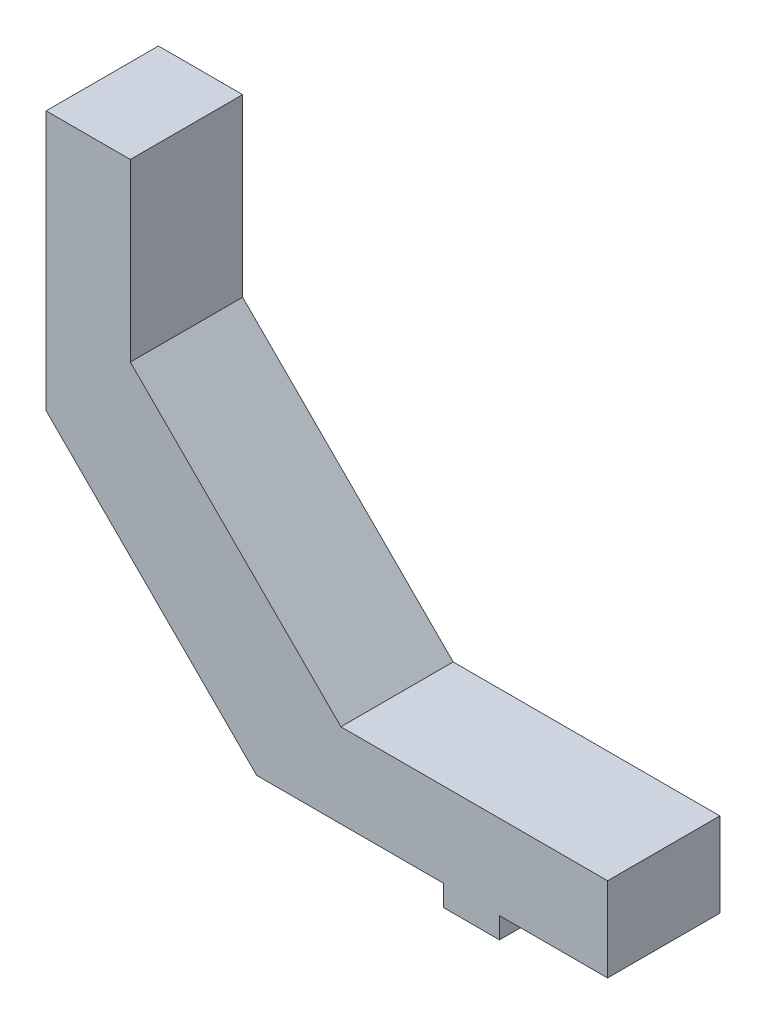
ISO-10303-21;
HEADER;
FILE_DESCRIPTION(('STEP AP214'),'2;1');
FILE_NAME('part.step','',(''),(''),'','','');
FILE_SCHEMA(('AUTOMOTIVE_DESIGN { 1 0 10303 214 1 1 1 1 }'));
ENDSEC;
DATA;
#1=APPLICATION_CONTEXT('core data for automotive mechanical design processes');
#2=APPLICATION_PROTOCOL_DEFINITION('international standard','automotive_design',2000,#1);
#3=PRODUCT_CONTEXT('',#1,'mechanical');
#4=PRODUCT('Part','Part','',(#3));
#5=PRODUCT_RELATED_PRODUCT_CATEGORY('part','',(#4));
#6=PRODUCT_DEFINITION_FORMATION('','',#4);
#7=PRODUCT_DEFINITION_CONTEXT('part definition',#1,'design');
#8=PRODUCT_DEFINITION('design','',#6,#7);
#9=PRODUCT_DEFINITION_SHAPE('','',#8);
#10=(LENGTH_UNIT() NAMED_UNIT(*) SI_UNIT(.MILLI.,.METRE.));
#11=(NAMED_UNIT(*) PLANE_ANGLE_UNIT() SI_UNIT($,.RADIAN.));
#12=(NAMED_UNIT(*) SI_UNIT($,.STERADIAN.) SOLID_ANGLE_UNIT());
#13=UNCERTAINTY_MEASURE_WITH_UNIT(LENGTH_MEASURE(1.E-05),#10,'distance_accuracy_value','');
#14=(GEOMETRIC_REPRESENTATION_CONTEXT(3) GLOBAL_UNCERTAINTY_ASSIGNED_CONTEXT((#13)) GLOBAL_UNIT_ASSIGNED_CONTEXT((#10,
#11,#12)) REPRESENTATION_CONTEXT('',''));
#15=CARTESIAN_POINT('',(0.,0.,0.));
#16=DIRECTION('',(0.,0.,1.));
#17=DIRECTION('',(1.,0.,0.));
#18=AXIS2_PLACEMENT_3D('',#15,#16,#17);
#19=CARTESIAN_POINT('',(0.,0.,0.));
#20=DIRECTION('',(0.,-1.,0.));
#21=DIRECTION('',(0.,0.,-1.));
#22=AXIS2_PLACEMENT_3D('',#19,#20,#21);
#23=PLANE('',#22);
#24=DIRECTION('',(1.,0.,0.));
#25=VECTOR('',#24,1.);
#26=CARTESIAN_POINT('',(-40.,0.,8.));
#27=LINE('',#26,#25);
#28=CARTESIAN_POINT('',(-9.99999999999989,0.,8.));
#29=VERTEX_POINT('',#28);
#30=CARTESIAN_POINT('',(16.6,0.,8.));
#31=VERTEX_POINT('',#30);
#32=EDGE_CURVE('E168',#29,#31,#27,.T.);
#33=ORIENTED_EDGE('',*,*,#32,.F.);
#34=DIRECTION('',(0.,0.,-1.));
#35=VECTOR('',#34,1.);
#36=CARTESIAN_POINT('',(-9.99999999999989,0.,-8.));
#37=LINE('',#36,#35);
#38=CARTESIAN_POINT('',(-9.99999999999989,0.,-8.));
#39=VERTEX_POINT('',#38);
#40=EDGE_CURVE('E27',#29,#39,#37,.T.);
#41=ORIENTED_EDGE('',*,*,#40,.T.);
#42=DIRECTION('',(-1.,0.,0.));
#43=VECTOR('',#42,1.);
#44=CARTESIAN_POINT('',(-40.,0.,-8.));
#45=LINE('',#44,#43);
#46=CARTESIAN_POINT('',(16.6,0.,-8.));
#47=VERTEX_POINT('',#46);
#48=EDGE_CURVE('E158',#47,#39,#45,.T.);
#49=ORIENTED_EDGE('',*,*,#48,.F.);
#50=DIRECTION('',(0.,0.,-1.));
#51=VECTOR('',#50,1.);
#52=CARTESIAN_POINT('',(16.6,0.,8.));
#53=LINE('',#52,#51);
#54=EDGE_CURVE('E131',#31,#47,#53,.T.);
#55=ORIENTED_EDGE('',*,*,#54,.F.);
#56=EDGE_LOOP('',(#33,#41,#49,#55));
#57=FACE_BOUND('',#56,.T.);
#58=ADVANCED_FACE('F19',(#57),#23,.T.);
#59=CARTESIAN_POINT('',(0.,12.,0.));
#60=DIRECTION('',(0.,-1.,0.));
#61=DIRECTION('',(0.,0.,-1.));
#62=AXIS2_PLACEMENT_3D('',#59,#60,#61);
#63=PLANE('',#62);
#64=DIRECTION('',(-1.,0.,0.));
#65=VECTOR('',#64,1.);
#66=CARTESIAN_POINT('',(-40.,12.,-8.));
#67=LINE('',#66,#65);
#68=CARTESIAN_POINT('',(40.,12.,-8.));
#69=VERTEX_POINT('',#68);
#70=CARTESIAN_POINT('',(1.99999999999991,12.,-8.));
#71=VERTEX_POINT('',#70);
#72=EDGE_CURVE('E202',#69,#71,#67,.T.);
#73=ORIENTED_EDGE('',*,*,#72,.T.);
#74=DIRECTION('',(0.,0.,1.));
#75=VECTOR('',#74,1.);
#76=CARTESIAN_POINT('',(1.99999999999992,12.,8.));
#77=LINE('',#76,#75);
#78=CARTESIAN_POINT('',(1.99999999999992,12.,8.));
#79=VERTEX_POINT('',#78);
#80=EDGE_CURVE('E247',#71,#79,#77,.T.);
#81=ORIENTED_EDGE('',*,*,#80,.T.);
#82=DIRECTION('',(1.,0.,0.));
#83=VECTOR('',#82,1.);
#84=CARTESIAN_POINT('',(-40.,12.,8.));
#85=LINE('',#84,#83);
#86=CARTESIAN_POINT('',(40.,12.,8.));
#87=VERTEX_POINT('',#86);
#88=EDGE_CURVE('E205',#79,#87,#85,.T.);
#89=ORIENTED_EDGE('',*,*,#88,.T.);
#90=DIRECTION('',(0.,0.,-1.));
#91=VECTOR('',#90,1.);
#92=CARTESIAN_POINT('',(40.,12.,8.));
#93=LINE('',#92,#91);
#94=EDGE_CURVE('E169',#87,#69,#93,.T.);
#95=ORIENTED_EDGE('',*,*,#94,.T.);
#96=EDGE_LOOP('',(#73,#81,#89,#95));
#97=FACE_BOUND('',#96,.T.);
#98=ADVANCED_FACE('F256',(#97),#63,.F.);
#99=CARTESIAN_POINT('',(40.,12.,8.));
#100=DIRECTION('',(-1.,0.,0.));
#101=DIRECTION('',(0.,0.,1.));
#102=AXIS2_PLACEMENT_3D('',#99,#100,#101);
#103=PLANE('',#102);
#104=DIRECTION('',(0.,0.,-1.));
#105=VECTOR('',#104,1.);
#106=CARTESIAN_POINT('',(40.,0.,8.));
#107=LINE('',#106,#105);
#108=CARTESIAN_POINT('',(40.,0.,8.));
#109=VERTEX_POINT('',#108);
#110=CARTESIAN_POINT('',(40.,0.,-8.));
#111=VERTEX_POINT('',#110);
#112=EDGE_CURVE('E174',#109,#111,#107,.T.);
#113=ORIENTED_EDGE('',*,*,#112,.T.);
#114=DIRECTION('',(0.,-1.,0.));
#115=VECTOR('',#114,1.);
#116=CARTESIAN_POINT('',(40.,12.,-8.));
#117=LINE('',#116,#115);
#118=EDGE_CURVE('E206',#69,#111,#117,.T.);
#119=ORIENTED_EDGE('',*,*,#118,.F.);
#120=ORIENTED_EDGE('',*,*,#94,.F.);
#121=DIRECTION('',(0.,-1.,0.));
#122=VECTOR('',#121,1.);
#123=CARTESIAN_POINT('',(40.,12.,8.));
#124=LINE('',#123,#122);
#125=EDGE_CURVE('E239',#87,#109,#124,.T.);
#126=ORIENTED_EDGE('',*,*,#125,.T.);
#127=EDGE_LOOP('',(#113,#119,#120,#126));
#128=FACE_BOUND('',#127,.T.);
#129=ADVANCED_FACE('F258',(#128),#103,.F.);
#130=CARTESIAN_POINT('',(-40.,12.,-8.));
#131=DIRECTION('',(0.,0.,1.));
#132=DIRECTION('',(1.,0.,0.));
#133=AXIS2_PLACEMENT_3D('',#130,#131,#132);
#134=PLANE('',#133);
#135=ORIENTED_EDGE('',*,*,#48,.T.);
#136=DIRECTION('',(-0.707106781186549,0.707106781186546,0.));
#137=VECTOR('',#136,1.);
#138=CARTESIAN_POINT('',(-40.,30.,-8.));
#139=LINE('',#138,#137);
#140=CARTESIAN_POINT('',(-40.,30.,-8.));
#141=VERTEX_POINT('',#140);
#142=EDGE_CURVE('E12',#39,#141,#139,.T.);
#143=ORIENTED_EDGE('',*,*,#142,.T.);
#144=DIRECTION('',(0.,-1.,0.));
#145=VECTOR('',#144,1.);
#146=CARTESIAN_POINT('',(-40.,12.,-8.));
#147=LINE('',#146,#145);
#148=CARTESIAN_POINT('',(-40.,67.,-8.));
#149=VERTEX_POINT('',#148);
#150=EDGE_CURVE('E232',#149,#141,#147,.T.);
#151=ORIENTED_EDGE('',*,*,#150,.F.);
#152=DIRECTION('',(-1.,0.,0.));
#153=VECTOR('',#152,1.);
#154=CARTESIAN_POINT('',(-40.,67.,-8.));
#155=LINE('',#154,#153);
#156=CARTESIAN_POINT('',(-28.,67.,-8.));
#157=VERTEX_POINT('',#156);
#158=EDGE_CURVE('E201',#157,#149,#155,.T.);
#159=ORIENTED_EDGE('',*,*,#158,.F.);
#160=DIRECTION('',(0.,-1.,0.));
#161=VECTOR('',#160,1.);
#162=CARTESIAN_POINT('',(-28.,67.,-8.));
#163=LINE('',#162,#161);
#164=CARTESIAN_POINT('',(-28.,42.,-8.));
#165=VERTEX_POINT('',#164);
#166=EDGE_CURVE('E183',#157,#165,#163,.T.);
#167=ORIENTED_EDGE('',*,*,#166,.T.);
#168=DIRECTION('',(-0.707106781186544,0.707106781186551,0.));
#169=VECTOR('',#168,1.);
#170=CARTESIAN_POINT('',(-19.,33.,-8.));
#171=LINE('',#170,#169);
#172=EDGE_CURVE('E249',#165,#71,#171,.F.);
#173=ORIENTED_EDGE('',*,*,#172,.T.);
#174=ORIENTED_EDGE('',*,*,#72,.F.);
#175=ORIENTED_EDGE('',*,*,#118,.T.);
#176=CARTESIAN_POINT('',(24.6,0.,-8.));
#177=VERTEX_POINT('',#176);
#178=EDGE_CURVE('E173',#111,#177,#45,.T.);
#179=ORIENTED_EDGE('',*,*,#178,.T.);
#180=DIRECTION('',(0.,1.,0.));
#181=VECTOR('',#180,1.);
#182=CARTESIAN_POINT('',(24.6,-3.,-8.));
#183=LINE('',#182,#181);
#184=CARTESIAN_POINT('',(24.6,-3.,-8.));
#185=VERTEX_POINT('',#184);
#186=EDGE_CURVE('E114',#185,#177,#183,.T.);
#187=ORIENTED_EDGE('',*,*,#186,.F.);
#188=DIRECTION('',(1.,0.,0.));
#189=VECTOR('',#188,1.);
#190=CARTESIAN_POINT('',(16.6,-3.,-8.));
#191=LINE('',#190,#189);
#192=CARTESIAN_POINT('',(16.6,-3.,-8.));
#193=VERTEX_POINT('',#192);
#194=EDGE_CURVE('E106',#193,#185,#191,.T.);
#195=ORIENTED_EDGE('',*,*,#194,.F.);
#196=DIRECTION('',(0.,1.,0.));
#197=VECTOR('',#196,1.);
#198=CARTESIAN_POINT('',(16.6,-3.,-8.));
#199=LINE('',#198,#197);
#200=EDGE_CURVE('E110',#193,#47,#199,.T.);
#201=ORIENTED_EDGE('',*,*,#200,.T.);
#202=EDGE_LOOP('',(#135,#143,#151,#159,#167,#173,#174,#175,#179,#187,#195,#201));
#203=FACE_BOUND('',#202,.T.);
#204=ADVANCED_FACE('F108',(#203),#134,.F.);
#205=CARTESIAN_POINT('',(-40.,12.,8.));
#206=DIRECTION('',(1.,0.,0.));
#207=DIRECTION('',(0.,0.,-1.));
#208=AXIS2_PLACEMENT_3D('',#205,#206,#207);
#209=PLANE('',#208);
#210=ORIENTED_EDGE('',*,*,#150,.T.);
#211=DIRECTION('',(0.,0.,1.));
#212=VECTOR('',#211,1.);
#213=CARTESIAN_POINT('',(-40.,30.,8.));
#214=LINE('',#213,#212);
#215=CARTESIAN_POINT('',(-40.,30.,8.));
#216=VERTEX_POINT('',#215);
#217=EDGE_CURVE('E238',#141,#216,#214,.T.);
#218=ORIENTED_EDGE('',*,*,#217,.T.);
#219=DIRECTION('',(0.,-1.,0.));
#220=VECTOR('',#219,1.);
#221=CARTESIAN_POINT('',(-40.,12.,8.));
#222=LINE('',#221,#220);
#223=CARTESIAN_POINT('',(-40.,67.,8.));
#224=VERTEX_POINT('',#223);
#225=EDGE_CURVE('E237',#224,#216,#222,.T.);
#226=ORIENTED_EDGE('',*,*,#225,.F.);
#227=DIRECTION('',(0.,0.,1.));
#228=VECTOR('',#227,1.);
#229=CARTESIAN_POINT('',(-40.,67.,-8.));
#230=LINE('',#229,#228);
#231=EDGE_CURVE('E132',#149,#224,#230,.T.);
#232=ORIENTED_EDGE('',*,*,#231,.F.);
#233=EDGE_LOOP('',(#210,#218,#226,#232));
#234=FACE_BOUND('',#233,.T.);
#235=ADVANCED_FACE('F234',(#234),#209,.F.);
#236=CARTESIAN_POINT('',(-40.,12.,8.));
#237=DIRECTION('',(0.,0.,-1.));
#238=DIRECTION('',(-1.,0.,0.));
#239=AXIS2_PLACEMENT_3D('',#236,#237,#238);
#240=PLANE('',#239);
#241=ORIENTED_EDGE('',*,*,#225,.T.);
#242=DIRECTION('',(0.707106781186549,-0.707106781186546,0.));
#243=VECTOR('',#242,1.);
#244=CARTESIAN_POINT('',(-40.,30.,8.));
#245=LINE('',#244,#243);
#246=EDGE_CURVE('E41',#216,#29,#245,.T.);
#247=ORIENTED_EDGE('',*,*,#246,.T.);
#248=ORIENTED_EDGE('',*,*,#32,.T.);
#249=DIRECTION('',(0.,1.,0.));
#250=VECTOR('',#249,1.);
#251=CARTESIAN_POINT('',(16.6,-3.,8.));
#252=LINE('',#251,#250);
#253=CARTESIAN_POINT('',(16.6,-3.,8.));
#254=VERTEX_POINT('',#253);
#255=EDGE_CURVE('E146',#254,#31,#252,.T.);
#256=ORIENTED_EDGE('',*,*,#255,.F.);
#257=DIRECTION('',(-1.,0.,0.));
#258=VECTOR('',#257,1.);
#259=CARTESIAN_POINT('',(16.6,-3.,8.));
#260=LINE('',#259,#258);
#261=CARTESIAN_POINT('',(24.6,-3.,8.));
#262=VERTEX_POINT('',#261);
#263=EDGE_CURVE('E123',#262,#254,#260,.T.);
#264=ORIENTED_EDGE('',*,*,#263,.F.);
#265=DIRECTION('',(0.,1.,0.));
#266=VECTOR('',#265,1.);
#267=CARTESIAN_POINT('',(24.6,-3.,8.));
#268=LINE('',#267,#266);
#269=CARTESIAN_POINT('',(24.6,0.,8.));
#270=VERTEX_POINT('',#269);
#271=EDGE_CURVE('E137',#262,#270,#268,.T.);
#272=ORIENTED_EDGE('',*,*,#271,.T.);
#273=EDGE_CURVE('E170',#270,#109,#27,.T.);
#274=ORIENTED_EDGE('',*,*,#273,.T.);
#275=ORIENTED_EDGE('',*,*,#125,.F.);
#276=ORIENTED_EDGE('',*,*,#88,.F.);
#277=DIRECTION('',(0.707106781186544,-0.707106781186551,0.));
#278=VECTOR('',#277,1.);
#279=CARTESIAN_POINT('',(-19.,33.,8.));
#280=LINE('',#279,#278);
#281=CARTESIAN_POINT('',(-28.,42.,8.));
#282=VERTEX_POINT('',#281);
#283=EDGE_CURVE('E224',#79,#282,#280,.F.);
#284=ORIENTED_EDGE('',*,*,#283,.T.);
#285=DIRECTION('',(0.,-1.,0.));
#286=VECTOR('',#285,1.);
#287=CARTESIAN_POINT('',(-28.,67.,8.));
#288=LINE('',#287,#286);
#289=CARTESIAN_POINT('',(-28.,67.,8.));
#290=VERTEX_POINT('',#289);
#291=EDGE_CURVE('E176',#290,#282,#288,.T.);
#292=ORIENTED_EDGE('',*,*,#291,.F.);
#293=DIRECTION('',(1.,0.,0.));
#294=VECTOR('',#293,1.);
#295=CARTESIAN_POINT('',(-40.,67.,8.));
#296=LINE('',#295,#294);
#297=EDGE_CURVE('E135',#224,#290,#296,.T.);
#298=ORIENTED_EDGE('',*,*,#297,.F.);
#299=EDGE_LOOP('',(#241,#247,#248,#256,#264,#272,#274,#275,#276,#284,#292,#298));
#300=FACE_BOUND('',#299,.T.);
#301=ADVANCED_FACE('F167',(#300),#240,.F.);
#302=DIRECTION('',(0.,0.,1.));
#303=VECTOR('',#302,1.);
#304=CARTESIAN_POINT('',(24.6,0.,8.));
#305=LINE('',#304,#303);
#306=EDGE_CURVE('E127',#177,#270,#305,.T.);
#307=ORIENTED_EDGE('',*,*,#306,.F.);
#308=ORIENTED_EDGE('',*,*,#178,.F.);
#309=ORIENTED_EDGE('',*,*,#112,.F.);
#310=ORIENTED_EDGE('',*,*,#273,.F.);
#311=EDGE_LOOP('',(#307,#308,#309,#310));
#312=FACE_BOUND('',#311,.T.);
#313=ADVANCED_FACE('F271',(#312),#23,.T.);
#314=CARTESIAN_POINT('',(-28.,67.,-8.));
#315=DIRECTION('',(-1.,0.,0.));
#316=DIRECTION('',(0.,0.,1.));
#317=AXIS2_PLACEMENT_3D('',#314,#315,#316);
#318=PLANE('',#317);
#319=ORIENTED_EDGE('',*,*,#291,.T.);
#320=DIRECTION('',(0.,0.,-1.));
#321=VECTOR('',#320,1.);
#322=CARTESIAN_POINT('',(-28.,42.,-8.));
#323=LINE('',#322,#321);
#324=EDGE_CURVE('E230',#282,#165,#323,.T.);
#325=ORIENTED_EDGE('',*,*,#324,.T.);
#326=ORIENTED_EDGE('',*,*,#166,.F.);
#327=DIRECTION('',(0.,0.,-1.));
#328=VECTOR('',#327,1.);
#329=CARTESIAN_POINT('',(-28.,67.,-8.));
#330=LINE('',#329,#328);
#331=EDGE_CURVE('E214',#290,#157,#330,.T.);
#332=ORIENTED_EDGE('',*,*,#331,.F.);
#333=EDGE_LOOP('',(#319,#325,#326,#332));
#334=FACE_BOUND('',#333,.T.);
#335=ADVANCED_FACE('F228',(#334),#318,.F.);
#336=CARTESIAN_POINT('',(0.,67.,0.));
#337=DIRECTION('',(0.,1.,0.));
#338=DIRECTION('',(0.,0.,1.));
#339=AXIS2_PLACEMENT_3D('',#336,#337,#338);
#340=PLANE('',#339);
#341=ORIENTED_EDGE('',*,*,#231,.T.);
#342=ORIENTED_EDGE('',*,*,#297,.T.);
#343=ORIENTED_EDGE('',*,*,#331,.T.);
#344=ORIENTED_EDGE('',*,*,#158,.T.);
#345=EDGE_LOOP('',(#341,#342,#343,#344));
#346=FACE_BOUND('',#345,.T.);
#347=ADVANCED_FACE('F218',(#346),#340,.T.);
#348=CARTESIAN_POINT('',(16.6,-3.,8.));
#349=DIRECTION('',(1.,0.,0.));
#350=DIRECTION('',(0.,0.,-1.));
#351=AXIS2_PLACEMENT_3D('',#348,#349,#350);
#352=PLANE('',#351);
#353=ORIENTED_EDGE('',*,*,#54,.T.);
#354=ORIENTED_EDGE('',*,*,#200,.F.);
#355=DIRECTION('',(0.,0.,-1.));
#356=VECTOR('',#355,1.);
#357=CARTESIAN_POINT('',(16.6,-3.,8.));
#358=LINE('',#357,#356);
#359=EDGE_CURVE('E118',#254,#193,#358,.T.);
#360=ORIENTED_EDGE('',*,*,#359,.F.);
#361=ORIENTED_EDGE('',*,*,#255,.T.);
#362=EDGE_LOOP('',(#353,#354,#360,#361));
#363=FACE_BOUND('',#362,.T.);
#364=ADVANCED_FACE('F129',(#363),#352,.F.);
#365=CARTESIAN_POINT('',(24.6,-3.,8.));
#366=DIRECTION('',(-1.,0.,0.));
#367=DIRECTION('',(0.,0.,1.));
#368=AXIS2_PLACEMENT_3D('',#365,#366,#367);
#369=PLANE('',#368);
#370=ORIENTED_EDGE('',*,*,#306,.T.);
#371=ORIENTED_EDGE('',*,*,#271,.F.);
#372=DIRECTION('',(0.,0.,1.));
#373=VECTOR('',#372,1.);
#374=CARTESIAN_POINT('',(24.6,-3.,8.));
#375=LINE('',#374,#373);
#376=EDGE_CURVE('E117',#185,#262,#375,.T.);
#377=ORIENTED_EDGE('',*,*,#376,.F.);
#378=ORIENTED_EDGE('',*,*,#186,.T.);
#379=EDGE_LOOP('',(#370,#371,#377,#378));
#380=FACE_BOUND('',#379,.T.);
#381=ADVANCED_FACE('F166',(#380),#369,.F.);
#382=CARTESIAN_POINT('',(0.,-3.,0.));
#383=DIRECTION('',(0.,-1.,0.));
#384=DIRECTION('',(0.,0.,-1.));
#385=AXIS2_PLACEMENT_3D('',#382,#383,#384);
#386=PLANE('',#385);
#387=ORIENTED_EDGE('',*,*,#359,.T.);
#388=ORIENTED_EDGE('',*,*,#194,.T.);
#389=ORIENTED_EDGE('',*,*,#376,.T.);
#390=ORIENTED_EDGE('',*,*,#263,.T.);
#391=EDGE_LOOP('',(#387,#388,#389,#390));
#392=FACE_BOUND('',#391,.T.);
#393=ADVANCED_FACE('F121',(#392),#386,.T.);
#394=CARTESIAN_POINT('',(-28.,42.,-8.));
#395=DIRECTION('',(0.707106781186551,0.707106781186544,0.));
#396=DIRECTION('',(0.,0.,1.));
#397=AXIS2_PLACEMENT_3D('',#394,#395,#396);
#398=PLANE('',#397);
#399=ORIENTED_EDGE('',*,*,#283,.F.);
#400=ORIENTED_EDGE('',*,*,#80,.F.);
#401=ORIENTED_EDGE('',*,*,#172,.F.);
#402=ORIENTED_EDGE('',*,*,#324,.F.);
#403=EDGE_LOOP('',(#399,#400,#401,#402));
#404=FACE_BOUND('',#403,.T.);
#405=ADVANCED_FACE('F257',(#404),#398,.T.);
#406=CARTESIAN_POINT('',(-40.,30.,8.));
#407=DIRECTION('',(-0.707106781186546,-0.707106781186549,0.));
#408=DIRECTION('',(0.,0.,-1.));
#409=AXIS2_PLACEMENT_3D('',#406,#407,#408);
#410=PLANE('',#409);
#411=ORIENTED_EDGE('',*,*,#142,.F.);
#412=ORIENTED_EDGE('',*,*,#40,.F.);
#413=ORIENTED_EDGE('',*,*,#246,.F.);
#414=ORIENTED_EDGE('',*,*,#217,.F.);
#415=EDGE_LOOP('',(#411,#412,#413,#414));
#416=FACE_BOUND('',#415,.T.);
#417=ADVANCED_FACE('F21',(#416),#410,.T.);
#418=CLOSED_SHELL('',(#58,#98,#129,#204,#235,#301,#313,#335,#347,#364,#381,#393,#405,#417));
#419=MANIFOLD_SOLID_BREP('B1',#418);
#420=ADVANCED_BREP_SHAPE_REPRESENTATION('',(#18,#419),#14);
#421=SHAPE_DEFINITION_REPRESENTATION(#9,#420);
ENDSEC;
END-ISO-10303-21;
